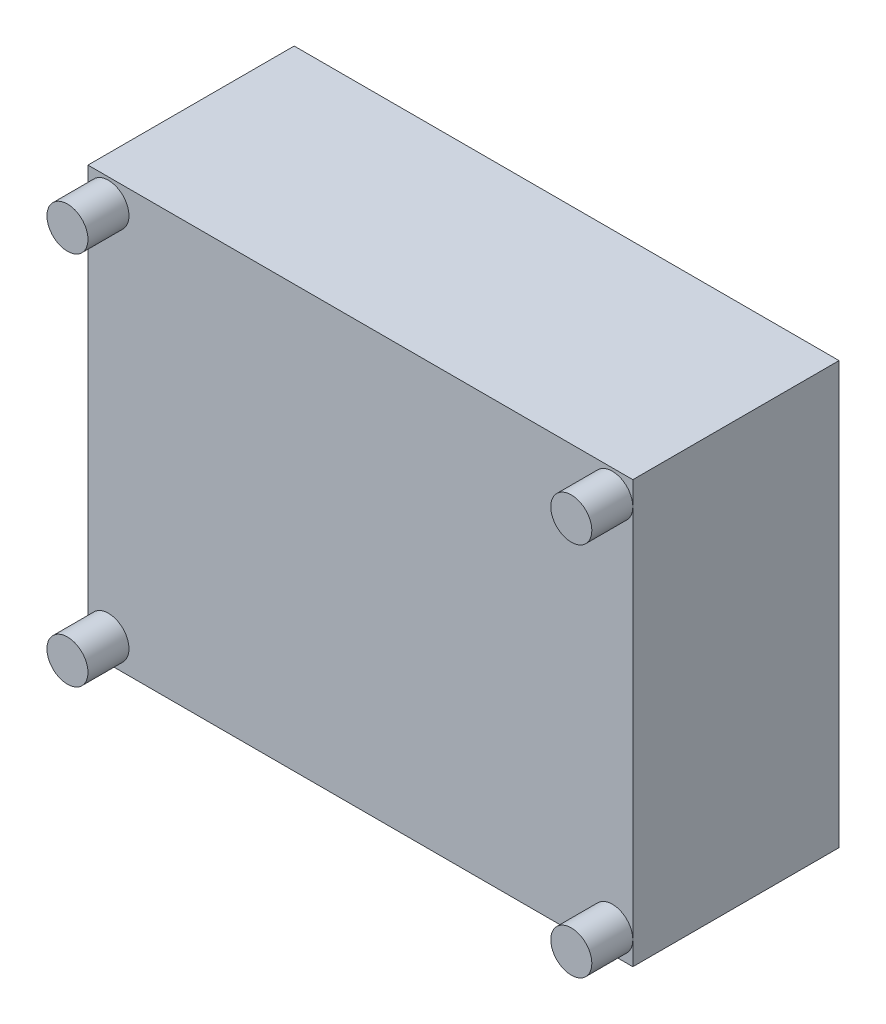
ISO-10303-21;
HEADER;
FILE_DESCRIPTION(('STEP AP214'),'2;1');
FILE_NAME('part.step','',(''),(''),'','','');
FILE_SCHEMA(('AUTOMOTIVE_DESIGN { 1 0 10303 214 1 1 1 1 }'));
ENDSEC;
DATA;
#1=APPLICATION_CONTEXT('core data for automotive mechanical design processes');
#2=APPLICATION_PROTOCOL_DEFINITION('international standard','automotive_design',2000,#1);
#3=PRODUCT_CONTEXT('',#1,'mechanical');
#4=PRODUCT('Part','Part','',(#3));
#5=PRODUCT_RELATED_PRODUCT_CATEGORY('part','',(#4));
#6=PRODUCT_DEFINITION_FORMATION('','',#4);
#7=PRODUCT_DEFINITION_CONTEXT('part definition',#1,'design');
#8=PRODUCT_DEFINITION('design','',#6,#7);
#9=PRODUCT_DEFINITION_SHAPE('','',#8);
#10=(LENGTH_UNIT() NAMED_UNIT(*) SI_UNIT(.MILLI.,.METRE.));
#11=(NAMED_UNIT(*) PLANE_ANGLE_UNIT() SI_UNIT($,.RADIAN.));
#12=(NAMED_UNIT(*) SI_UNIT($,.STERADIAN.) SOLID_ANGLE_UNIT());
#13=UNCERTAINTY_MEASURE_WITH_UNIT(LENGTH_MEASURE(1.E-05),#10,'distance_accuracy_value','');
#14=(GEOMETRIC_REPRESENTATION_CONTEXT(3) GLOBAL_UNCERTAINTY_ASSIGNED_CONTEXT((#13)) GLOBAL_UNIT_ASSIGNED_CONTEXT((#10,
#11,#12)) REPRESENTATION_CONTEXT('',''));
#15=CARTESIAN_POINT('',(0.,0.,0.));
#16=DIRECTION('',(0.,0.,1.));
#17=DIRECTION('',(1.,0.,0.));
#18=AXIS2_PLACEMENT_3D('',#15,#16,#17);
#19=CARTESIAN_POINT('',(0.,0.,35.2));
#20=DIRECTION('',(1.,0.,0.));
#21=DIRECTION('',(0.,1.,0.));
#22=AXIS2_PLACEMENT_3D('',#19,#20,#21);
#23=PLANE('',#22);
#24=DIRECTION('',(0.,-1.,0.));
#25=VECTOR('',#24,1.);
#26=CARTESIAN_POINT('',(0.,0.,0.));
#27=LINE('',#26,#25);
#28=CARTESIAN_POINT('',(0.,0.,0.));
#29=VERTEX_POINT('',#28);
#30=CARTESIAN_POINT('',(0.,-72.,0.));
#31=VERTEX_POINT('',#30);
#32=EDGE_CURVE('E107',#29,#31,#27,.T.);
#33=ORIENTED_EDGE('',*,*,#32,.T.);
#34=DIRECTION('',(0.,0.,-1.));
#35=VECTOR('',#34,1.);
#36=CARTESIAN_POINT('',(0.,-72.,35.2));
#37=LINE('',#36,#35);
#38=CARTESIAN_POINT('',(0.,-72.,35.2));
#39=VERTEX_POINT('',#38);
#40=EDGE_CURVE('E11',#39,#31,#37,.T.);
#41=ORIENTED_EDGE('',*,*,#40,.F.);
#42=DIRECTION('',(0.,-1.,0.));
#43=VECTOR('',#42,1.);
#44=CARTESIAN_POINT('',(0.,0.,35.2));
#45=LINE('',#44,#43);
#46=CARTESIAN_POINT('',(0.,-68.,35.2));
#47=VERTEX_POINT('',#46);
#48=EDGE_CURVE('E117',#47,#39,#45,.T.);
#49=ORIENTED_EDGE('',*,*,#48,.F.);
#50=CARTESIAN_POINT('',(0.,-4.,35.2));
#51=VERTEX_POINT('',#50);
#52=EDGE_CURVE('E138',#51,#47,#45,.T.);
#53=ORIENTED_EDGE('',*,*,#52,.F.);
#54=CARTESIAN_POINT('',(0.,0.,35.2));
#55=VERTEX_POINT('',#54);
#56=EDGE_CURVE('E136',#55,#51,#45,.T.);
#57=ORIENTED_EDGE('',*,*,#56,.F.);
#58=DIRECTION('',(0.,0.,-1.));
#59=VECTOR('',#58,1.);
#60=CARTESIAN_POINT('',(0.,0.,35.2));
#61=LINE('',#60,#59);
#62=EDGE_CURVE('E106',#55,#29,#61,.T.);
#63=ORIENTED_EDGE('',*,*,#62,.T.);
#64=EDGE_LOOP('',(#33,#41,#49,#53,#57,#63));
#65=FACE_BOUND('',#64,.T.);
#66=ADVANCED_FACE('F33',(#65),#23,.F.);
#67=CARTESIAN_POINT('',(0.,-72.,35.2));
#68=DIRECTION('',(0.,1.,0.));
#69=DIRECTION('',(0.,0.,1.));
#70=AXIS2_PLACEMENT_3D('',#67,#68,#69);
#71=PLANE('',#70);
#72=DIRECTION('',(1.,0.,0.));
#73=VECTOR('',#72,1.);
#74=CARTESIAN_POINT('',(0.,-72.,0.));
#75=LINE('',#74,#73);
#76=CARTESIAN_POINT('',(93.,-72.,0.));
#77=VERTEX_POINT('',#76);
#78=EDGE_CURVE('E110',#31,#77,#75,.T.);
#79=ORIENTED_EDGE('',*,*,#78,.T.);
#80=DIRECTION('',(0.,0.,-1.));
#81=VECTOR('',#80,1.);
#82=CARTESIAN_POINT('',(93.,-72.,35.2));
#83=LINE('',#82,#81);
#84=CARTESIAN_POINT('',(93.,-72.,35.2));
#85=VERTEX_POINT('',#84);
#86=EDGE_CURVE('E40',#85,#77,#83,.T.);
#87=ORIENTED_EDGE('',*,*,#86,.F.);
#88=DIRECTION('',(1.,0.,0.));
#89=VECTOR('',#88,1.);
#90=CARTESIAN_POINT('',(0.,-72.,35.2));
#91=LINE('',#90,#89);
#92=EDGE_CURVE('E91',#39,#85,#91,.T.);
#93=ORIENTED_EDGE('',*,*,#92,.F.);
#94=ORIENTED_EDGE('',*,*,#40,.T.);
#95=EDGE_LOOP('',(#79,#87,#93,#94));
#96=FACE_BOUND('',#95,.T.);
#97=ADVANCED_FACE('F143',(#96),#71,.F.);
#98=CARTESIAN_POINT('',(93.,0.,35.2));
#99=DIRECTION('',(-1.,0.,0.));
#100=DIRECTION('',(0.,-1.,0.));
#101=AXIS2_PLACEMENT_3D('',#98,#99,#100);
#102=PLANE('',#101);
#103=DIRECTION('',(0.,1.,0.));
#104=VECTOR('',#103,1.);
#105=CARTESIAN_POINT('',(93.,0.,0.));
#106=LINE('',#105,#104);
#107=CARTESIAN_POINT('',(93.,0.,0.));
#108=VERTEX_POINT('',#107);
#109=EDGE_CURVE('E113',#77,#108,#106,.T.);
#110=ORIENTED_EDGE('',*,*,#109,.T.);
#111=DIRECTION('',(0.,0.,-1.));
#112=VECTOR('',#111,1.);
#113=CARTESIAN_POINT('',(93.,0.,35.2));
#114=LINE('',#113,#112);
#115=CARTESIAN_POINT('',(93.,0.,35.2));
#116=VERTEX_POINT('',#115);
#117=EDGE_CURVE('E120',#116,#108,#114,.T.);
#118=ORIENTED_EDGE('',*,*,#117,.F.);
#119=DIRECTION('',(0.,1.,0.));
#120=VECTOR('',#119,1.);
#121=CARTESIAN_POINT('',(93.,0.,35.2));
#122=LINE('',#121,#120);
#123=CARTESIAN_POINT('',(93.,-4.,35.2));
#124=VERTEX_POINT('',#123);
#125=EDGE_CURVE('E98',#124,#116,#122,.T.);
#126=ORIENTED_EDGE('',*,*,#125,.F.);
#127=CARTESIAN_POINT('',(93.,-68.,35.2));
#128=VERTEX_POINT('',#127);
#129=EDGE_CURVE('E96',#128,#124,#122,.T.);
#130=ORIENTED_EDGE('',*,*,#129,.F.);
#131=EDGE_CURVE('E83',#85,#128,#122,.T.);
#132=ORIENTED_EDGE('',*,*,#131,.F.);
#133=ORIENTED_EDGE('',*,*,#86,.T.);
#134=EDGE_LOOP('',(#110,#118,#126,#130,#132,#133));
#135=FACE_BOUND('',#134,.T.);
#136=ADVANCED_FACE('F100',(#135),#102,.F.);
#137=CARTESIAN_POINT('',(0.,0.,35.2));
#138=DIRECTION('',(0.,-1.,0.));
#139=DIRECTION('',(0.,0.,-1.));
#140=AXIS2_PLACEMENT_3D('',#137,#138,#139);
#141=PLANE('',#140);
#142=DIRECTION('',(-1.,0.,0.));
#143=VECTOR('',#142,1.);
#144=CARTESIAN_POINT('',(0.,0.,0.));
#145=LINE('',#144,#143);
#146=EDGE_CURVE('E115',#108,#29,#145,.T.);
#147=ORIENTED_EDGE('',*,*,#146,.T.);
#148=ORIENTED_EDGE('',*,*,#62,.F.);
#149=DIRECTION('',(-1.,0.,0.));
#150=VECTOR('',#149,1.);
#151=CARTESIAN_POINT('',(0.,0.,35.2));
#152=LINE('',#151,#150);
#153=EDGE_CURVE('E95',#116,#55,#152,.T.);
#154=ORIENTED_EDGE('',*,*,#153,.F.);
#155=ORIENTED_EDGE('',*,*,#117,.T.);
#156=EDGE_LOOP('',(#147,#148,#154,#155));
#157=FACE_BOUND('',#156,.T.);
#158=ADVANCED_FACE('F130',(#157),#141,.F.);
#159=CARTESIAN_POINT('',(0.,0.,35.2));
#160=DIRECTION('',(0.,0.,1.));
#161=DIRECTION('',(1.,0.,0.));
#162=AXIS2_PLACEMENT_3D('',#159,#160,#161);
#163=PLANE('',#162);
#164=ORIENTED_EDGE('',*,*,#56,.T.);
#165=CARTESIAN_POINT('',(3.50000000000001,-4.,35.2));
#166=DIRECTION('',(0.,0.,1.));
#167=DIRECTION('',(1.,0.,0.));
#168=AXIS2_PLACEMENT_3D('',#165,#166,#167);
#169=CIRCLE('',#168,3.5);
#170=EDGE_CURVE('E45',#51,#51,#169,.T.);
#171=ORIENTED_EDGE('',*,*,#170,.F.);
#172=ORIENTED_EDGE('',*,*,#52,.T.);
#173=CARTESIAN_POINT('',(3.50000000000001,-68.,35.2));
#174=DIRECTION('',(0.,0.,1.));
#175=DIRECTION('',(1.,0.,0.));
#176=AXIS2_PLACEMENT_3D('',#173,#174,#175);
#177=CIRCLE('',#176,3.5);
#178=EDGE_CURVE('E142',#47,#47,#177,.T.);
#179=ORIENTED_EDGE('',*,*,#178,.F.);
#180=ORIENTED_EDGE('',*,*,#48,.T.);
#181=ORIENTED_EDGE('',*,*,#92,.T.);
#182=ORIENTED_EDGE('',*,*,#131,.T.);
#183=CARTESIAN_POINT('',(89.5,-68.,35.2));
#184=DIRECTION('',(0.,0.,1.));
#185=DIRECTION('',(1.,0.,0.));
#186=AXIS2_PLACEMENT_3D('',#183,#184,#185);
#187=CIRCLE('',#186,3.50000000000001);
#188=EDGE_CURVE('E89',#128,#128,#187,.T.);
#189=ORIENTED_EDGE('',*,*,#188,.F.);
#190=ORIENTED_EDGE('',*,*,#129,.T.);
#191=CARTESIAN_POINT('',(89.5,-4.,35.2));
#192=DIRECTION('',(0.,0.,1.));
#193=DIRECTION('',(1.,0.,0.));
#194=AXIS2_PLACEMENT_3D('',#191,#192,#193);
#195=CIRCLE('',#194,3.50000000000001);
#196=EDGE_CURVE('E50',#124,#124,#195,.T.);
#197=ORIENTED_EDGE('',*,*,#196,.F.);
#198=ORIENTED_EDGE('',*,*,#125,.T.);
#199=ORIENTED_EDGE('',*,*,#153,.T.);
#200=EDGE_LOOP('',(#164,#171,#172,#179,#180,#181,#182,#189,#190,#197,#198,#199));
#201=FACE_BOUND('',#200,.T.);
#202=ADVANCED_FACE('F86',(#201),#163,.T.);
#203=CARTESIAN_POINT('',(0.,0.,0.));
#204=DIRECTION('',(0.,0.,1.));
#205=DIRECTION('',(1.,0.,0.));
#206=AXIS2_PLACEMENT_3D('',#203,#204,#205);
#207=PLANE('',#206);
#208=CARTESIAN_POINT('',(3.50000000000001,-4.,0.));
#209=DIRECTION('',(0.,0.,-1.));
#210=DIRECTION('',(-1.,0.,0.));
#211=AXIS2_PLACEMENT_3D('',#208,#209,#210);
#212=CIRCLE('',#211,1.75);
#213=CARTESIAN_POINT('',(1.75000000000001,-4.,0.));
#214=VERTEX_POINT('',#213);
#215=EDGE_CURVE('E252',#214,#214,#212,.T.);
#216=ORIENTED_EDGE('',*,*,#215,.F.);
#217=EDGE_LOOP('',(#216));
#218=FACE_BOUND('',#217,.T.);
#219=CARTESIAN_POINT('',(89.5,-68.,0.));
#220=DIRECTION('',(0.,0.,-1.));
#221=DIRECTION('',(-1.,0.,0.));
#222=AXIS2_PLACEMENT_3D('',#219,#220,#221);
#223=CIRCLE('',#222,1.75);
#224=CARTESIAN_POINT('',(87.75,-68.,0.));
#225=VERTEX_POINT('',#224);
#226=EDGE_CURVE('E245',#225,#225,#223,.T.);
#227=ORIENTED_EDGE('',*,*,#226,.F.);
#228=EDGE_LOOP('',(#227));
#229=FACE_BOUND('',#228,.T.);
#230=CARTESIAN_POINT('',(3.50000000000001,-68.,0.));
#231=DIRECTION('',(0.,0.,-1.));
#232=DIRECTION('',(-1.,0.,0.));
#233=AXIS2_PLACEMENT_3D('',#230,#231,#232);
#234=CIRCLE('',#233,1.75);
#235=CARTESIAN_POINT('',(1.75000000000001,-68.,0.));
#236=VERTEX_POINT('',#235);
#237=EDGE_CURVE('E240',#236,#236,#234,.T.);
#238=ORIENTED_EDGE('',*,*,#237,.F.);
#239=EDGE_LOOP('',(#238));
#240=FACE_BOUND('',#239,.T.);
#241=CARTESIAN_POINT('',(89.5,-4.,0.));
#242=DIRECTION('',(0.,0.,-1.));
#243=DIRECTION('',(-1.,0.,0.));
#244=AXIS2_PLACEMENT_3D('',#241,#242,#243);
#245=CIRCLE('',#244,1.75);
#246=CARTESIAN_POINT('',(87.75,-4.,0.));
#247=VERTEX_POINT('',#246);
#248=EDGE_CURVE('E251',#247,#247,#245,.T.);
#249=ORIENTED_EDGE('',*,*,#248,.F.);
#250=EDGE_LOOP('',(#249));
#251=FACE_BOUND('',#250,.T.);
#252=ORIENTED_EDGE('',*,*,#32,.F.);
#253=ORIENTED_EDGE('',*,*,#146,.F.);
#254=ORIENTED_EDGE('',*,*,#109,.F.);
#255=ORIENTED_EDGE('',*,*,#78,.F.);
#256=EDGE_LOOP('',(#252,#253,#254,#255));
#257=FACE_BOUND('',#256,.T.);
#258=ADVANCED_FACE('F127',(#218,#229,#240,#251,#257),#207,.F.);
#259=CARTESIAN_POINT('',(89.5,-4.,35.2));
#260=DIRECTION('',(0.,0.,-1.));
#261=DIRECTION('',(-1.,0.,0.));
#262=AXIS2_PLACEMENT_3D('',#259,#260,#261);
#263=CYLINDRICAL_SURFACE('',#262,1.75);
#264=CARTESIAN_POINT('',(89.5,-4.,35.2));
#265=DIRECTION('',(0.,0.,-1.));
#266=DIRECTION('',(-1.,0.,0.));
#267=AXIS2_PLACEMENT_3D('',#264,#265,#266);
#268=CIRCLE('',#267,1.75);
#269=CARTESIAN_POINT('',(87.75,-4.,35.2));
#270=VERTEX_POINT('',#269);
#271=EDGE_CURVE('E111',#270,#270,#268,.T.);
#272=ORIENTED_EDGE('',*,*,#271,.F.);
#273=EDGE_LOOP('',(#272));
#274=FACE_BOUND('',#273,.T.);
#275=ORIENTED_EDGE('',*,*,#248,.T.);
#276=EDGE_LOOP('',(#275));
#277=FACE_BOUND('',#276,.T.);
#278=ADVANCED_FACE('F155',(#274,#277),#263,.F.);
#279=CARTESIAN_POINT('',(3.50000000000001,-68.,35.2));
#280=DIRECTION('',(0.,0.,-1.));
#281=DIRECTION('',(-1.,0.,0.));
#282=AXIS2_PLACEMENT_3D('',#279,#280,#281);
#283=CYLINDRICAL_SURFACE('',#282,1.75);
#284=CARTESIAN_POINT('',(3.50000000000001,-68.,35.2));
#285=DIRECTION('',(0.,0.,-1.));
#286=DIRECTION('',(-1.,0.,0.));
#287=AXIS2_PLACEMENT_3D('',#284,#285,#286);
#288=CIRCLE('',#287,1.75);
#289=CARTESIAN_POINT('',(1.75000000000001,-68.,35.2));
#290=VERTEX_POINT('',#289);
#291=EDGE_CURVE('E242',#290,#290,#288,.T.);
#292=ORIENTED_EDGE('',*,*,#291,.F.);
#293=EDGE_LOOP('',(#292));
#294=FACE_BOUND('',#293,.T.);
#295=ORIENTED_EDGE('',*,*,#237,.T.);
#296=EDGE_LOOP('',(#295));
#297=FACE_BOUND('',#296,.T.);
#298=ADVANCED_FACE('F161',(#294,#297),#283,.F.);
#299=CARTESIAN_POINT('',(89.5,-68.,35.2));
#300=DIRECTION('',(0.,0.,-1.));
#301=DIRECTION('',(-1.,0.,0.));
#302=AXIS2_PLACEMENT_3D('',#299,#300,#301);
#303=CYLINDRICAL_SURFACE('',#302,1.75);
#304=CARTESIAN_POINT('',(89.5,-68.,35.2));
#305=DIRECTION('',(0.,0.,-1.));
#306=DIRECTION('',(-1.,0.,0.));
#307=AXIS2_PLACEMENT_3D('',#304,#305,#306);
#308=CIRCLE('',#307,1.75);
#309=CARTESIAN_POINT('',(87.75,-68.,35.2));
#310=VERTEX_POINT('',#309);
#311=EDGE_CURVE('E255',#310,#310,#308,.T.);
#312=ORIENTED_EDGE('',*,*,#311,.F.);
#313=EDGE_LOOP('',(#312));
#314=FACE_BOUND('',#313,.T.);
#315=ORIENTED_EDGE('',*,*,#226,.T.);
#316=EDGE_LOOP('',(#315));
#317=FACE_BOUND('',#316,.T.);
#318=ADVANCED_FACE('F163',(#314,#317),#303,.F.);
#319=CARTESIAN_POINT('',(3.50000000000001,-4.,35.2));
#320=DIRECTION('',(0.,0.,-1.));
#321=DIRECTION('',(-1.,0.,0.));
#322=AXIS2_PLACEMENT_3D('',#319,#320,#321);
#323=CYLINDRICAL_SURFACE('',#322,1.75);
#324=CARTESIAN_POINT('',(3.50000000000001,-4.,35.2));
#325=DIRECTION('',(0.,0.,-1.));
#326=DIRECTION('',(-1.,0.,0.));
#327=AXIS2_PLACEMENT_3D('',#324,#325,#326);
#328=CIRCLE('',#327,1.75);
#329=CARTESIAN_POINT('',(1.75000000000001,-4.,35.2));
#330=VERTEX_POINT('',#329);
#331=EDGE_CURVE('E248',#330,#330,#328,.T.);
#332=ORIENTED_EDGE('',*,*,#331,.F.);
#333=EDGE_LOOP('',(#332));
#334=FACE_BOUND('',#333,.T.);
#335=ORIENTED_EDGE('',*,*,#215,.T.);
#336=EDGE_LOOP('',(#335));
#337=FACE_BOUND('',#336,.T.);
#338=ADVANCED_FACE('F166',(#334,#337),#323,.F.);
#339=CARTESIAN_POINT('',(89.5,-68.,42.2));
#340=DIRECTION('',(0.,0.,1.));
#341=DIRECTION('',(1.,0.,0.));
#342=AXIS2_PLACEMENT_3D('',#339,#340,#341);
#343=PLANE('',#342);
#344=CARTESIAN_POINT('',(89.5,-68.,42.2));
#345=DIRECTION('',(0.,0.,1.));
#346=DIRECTION('',(1.,0.,0.));
#347=AXIS2_PLACEMENT_3D('',#344,#345,#346);
#348=CIRCLE('',#347,3.50000000000001);
#349=CARTESIAN_POINT('',(93.,-68.,42.2));
#350=VERTEX_POINT('',#349);
#351=EDGE_CURVE('E237',#350,#350,#348,.T.);
#352=ORIENTED_EDGE('',*,*,#351,.T.);
#353=EDGE_LOOP('',(#352));
#354=FACE_BOUND('',#353,.T.);
#355=ADVANCED_FACE('F170',(#354),#343,.T.);
#356=CARTESIAN_POINT('',(89.5,-68.,42.2));
#357=DIRECTION('',(0.,0.,-1.));
#358=DIRECTION('',(-1.,0.,0.));
#359=AXIS2_PLACEMENT_3D('',#356,#357,#358);
#360=CYLINDRICAL_SURFACE('',#359,3.50000000000001);
#361=ORIENTED_EDGE('',*,*,#351,.F.);
#362=EDGE_LOOP('',(#361));
#363=FACE_BOUND('',#362,.T.);
#364=ORIENTED_EDGE('',*,*,#188,.T.);
#365=EDGE_LOOP('',(#364));
#366=FACE_BOUND('',#365,.T.);
#367=ADVANCED_FACE('F175',(#363,#366),#360,.T.);
#368=CARTESIAN_POINT('',(89.5,-68.,35.2));
#369=DIRECTION('',(0.,0.,1.));
#370=DIRECTION('',(1.,0.,0.));
#371=AXIS2_PLACEMENT_3D('',#368,#369,#370);
#372=PLANE('',#371);
#373=ORIENTED_EDGE('',*,*,#311,.T.);
#374=EDGE_LOOP('',(#373));
#375=FACE_BOUND('',#374,.T.);
#376=ADVANCED_FACE('F178',(#375),#372,.F.);
#377=CARTESIAN_POINT('',(3.50000000000001,-68.,35.2));
#378=DIRECTION('',(0.,0.,1.));
#379=DIRECTION('',(1.,0.,0.));
#380=AXIS2_PLACEMENT_3D('',#377,#378,#379);
#381=PLANE('',#380);
#382=ORIENTED_EDGE('',*,*,#291,.T.);
#383=EDGE_LOOP('',(#382));
#384=FACE_BOUND('',#383,.T.);
#385=ADVANCED_FACE('F182',(#384),#381,.F.);
#386=CARTESIAN_POINT('',(3.50000000000001,-68.,42.2));
#387=DIRECTION('',(0.,0.,-1.));
#388=DIRECTION('',(-1.,0.,0.));
#389=AXIS2_PLACEMENT_3D('',#386,#387,#388);
#390=CYLINDRICAL_SURFACE('',#389,3.5);
#391=CARTESIAN_POINT('',(3.50000000000001,-68.,42.2));
#392=DIRECTION('',(0.,0.,1.));
#393=DIRECTION('',(1.,0.,0.));
#394=AXIS2_PLACEMENT_3D('',#391,#392,#393);
#395=CIRCLE('',#394,3.5);
#396=CARTESIAN_POINT('',(7.00000000000002,-68.,42.2));
#397=VERTEX_POINT('',#396);
#398=EDGE_CURVE('E233',#397,#397,#395,.T.);
#399=ORIENTED_EDGE('',*,*,#398,.F.);
#400=EDGE_LOOP('',(#399));
#401=FACE_BOUND('',#400,.T.);
#402=ORIENTED_EDGE('',*,*,#178,.T.);
#403=EDGE_LOOP('',(#402));
#404=FACE_BOUND('',#403,.T.);
#405=ADVANCED_FACE('F187',(#401,#404),#390,.T.);
#406=CARTESIAN_POINT('',(3.50000000000001,-68.,42.2));
#407=DIRECTION('',(0.,0.,1.));
#408=DIRECTION('',(1.,0.,0.));
#409=AXIS2_PLACEMENT_3D('',#406,#407,#408);
#410=PLANE('',#409);
#411=ORIENTED_EDGE('',*,*,#398,.T.);
#412=EDGE_LOOP('',(#411));
#413=FACE_BOUND('',#412,.T.);
#414=ADVANCED_FACE('F190',(#413),#410,.T.);
#415=CARTESIAN_POINT('',(89.5,-4.,35.2));
#416=DIRECTION('',(0.,0.,1.));
#417=DIRECTION('',(1.,0.,0.));
#418=AXIS2_PLACEMENT_3D('',#415,#416,#417);
#419=PLANE('',#418);
#420=ORIENTED_EDGE('',*,*,#271,.T.);
#421=EDGE_LOOP('',(#420));
#422=FACE_BOUND('',#421,.T.);
#423=ADVANCED_FACE('F197',(#422),#419,.F.);
#424=CARTESIAN_POINT('',(89.5,-4.,42.2));
#425=DIRECTION('',(0.,0.,-1.));
#426=DIRECTION('',(-1.,0.,0.));
#427=AXIS2_PLACEMENT_3D('',#424,#425,#426);
#428=CYLINDRICAL_SURFACE('',#427,3.50000000000001);
#429=CARTESIAN_POINT('',(89.5,-4.,42.2));
#430=DIRECTION('',(0.,0.,1.));
#431=DIRECTION('',(1.,0.,0.));
#432=AXIS2_PLACEMENT_3D('',#429,#430,#431);
#433=CIRCLE('',#432,3.50000000000001);
#434=CARTESIAN_POINT('',(93.,-4.,42.2));
#435=VERTEX_POINT('',#434);
#436=EDGE_CURVE('E227',#435,#435,#433,.T.);
#437=ORIENTED_EDGE('',*,*,#436,.F.);
#438=EDGE_LOOP('',(#437));
#439=FACE_BOUND('',#438,.T.);
#440=ORIENTED_EDGE('',*,*,#196,.T.);
#441=EDGE_LOOP('',(#440));
#442=FACE_BOUND('',#441,.T.);
#443=ADVANCED_FACE('F199',(#439,#442),#428,.T.);
#444=CARTESIAN_POINT('',(89.5,-4.,42.2));
#445=DIRECTION('',(0.,0.,1.));
#446=DIRECTION('',(1.,0.,0.));
#447=AXIS2_PLACEMENT_3D('',#444,#445,#446);
#448=PLANE('',#447);
#449=ORIENTED_EDGE('',*,*,#436,.T.);
#450=EDGE_LOOP('',(#449));
#451=FACE_BOUND('',#450,.T.);
#452=ADVANCED_FACE('F202',(#451),#448,.T.);
#453=CARTESIAN_POINT('',(3.50000000000001,-4.,35.2));
#454=DIRECTION('',(0.,0.,1.));
#455=DIRECTION('',(1.,0.,0.));
#456=AXIS2_PLACEMENT_3D('',#453,#454,#455);
#457=PLANE('',#456);
#458=ORIENTED_EDGE('',*,*,#331,.T.);
#459=EDGE_LOOP('',(#458));
#460=FACE_BOUND('',#459,.T.);
#461=ADVANCED_FACE('F209',(#460),#457,.F.);
#462=CARTESIAN_POINT('',(3.50000000000001,-4.,42.2));
#463=DIRECTION('',(0.,0.,-1.));
#464=DIRECTION('',(-1.,0.,0.));
#465=AXIS2_PLACEMENT_3D('',#462,#463,#464);
#466=CYLINDRICAL_SURFACE('',#465,3.5);
#467=CARTESIAN_POINT('',(3.50000000000001,-4.,42.2));
#468=DIRECTION('',(0.,0.,1.));
#469=DIRECTION('',(1.,0.,0.));
#470=AXIS2_PLACEMENT_3D('',#467,#468,#469);
#471=CIRCLE('',#470,3.5);
#472=CARTESIAN_POINT('',(7.00000000000001,-4.,42.2));
#473=VERTEX_POINT('',#472);
#474=EDGE_CURVE('E225',#473,#473,#471,.T.);
#475=ORIENTED_EDGE('',*,*,#474,.F.);
#476=EDGE_LOOP('',(#475));
#477=FACE_BOUND('',#476,.T.);
#478=ORIENTED_EDGE('',*,*,#170,.T.);
#479=EDGE_LOOP('',(#478));
#480=FACE_BOUND('',#479,.T.);
#481=ADVANCED_FACE('F211',(#477,#480),#466,.T.);
#482=CARTESIAN_POINT('',(3.50000000000001,-4.,42.2));
#483=DIRECTION('',(0.,0.,1.));
#484=DIRECTION('',(1.,0.,0.));
#485=AXIS2_PLACEMENT_3D('',#482,#483,#484);
#486=PLANE('',#485);
#487=ORIENTED_EDGE('',*,*,#474,.T.);
#488=EDGE_LOOP('',(#487));
#489=FACE_BOUND('',#488,.T.);
#490=ADVANCED_FACE('F214',(#489),#486,.T.);
#491=CLOSED_SHELL('',(#66,#97,#136,#158,#202,#258,#278,#298,#318,#338,#355,#367,#376,#385,#405,
#414,#423,#443,#452,#461,#481,#490));
#492=MANIFOLD_SOLID_BREP('B2',#491);
#493=ADVANCED_BREP_SHAPE_REPRESENTATION('',(#18,#492),#14);
#494=SHAPE_DEFINITION_REPRESENTATION(#9,#493);
ENDSEC;
END-ISO-10303-21;
